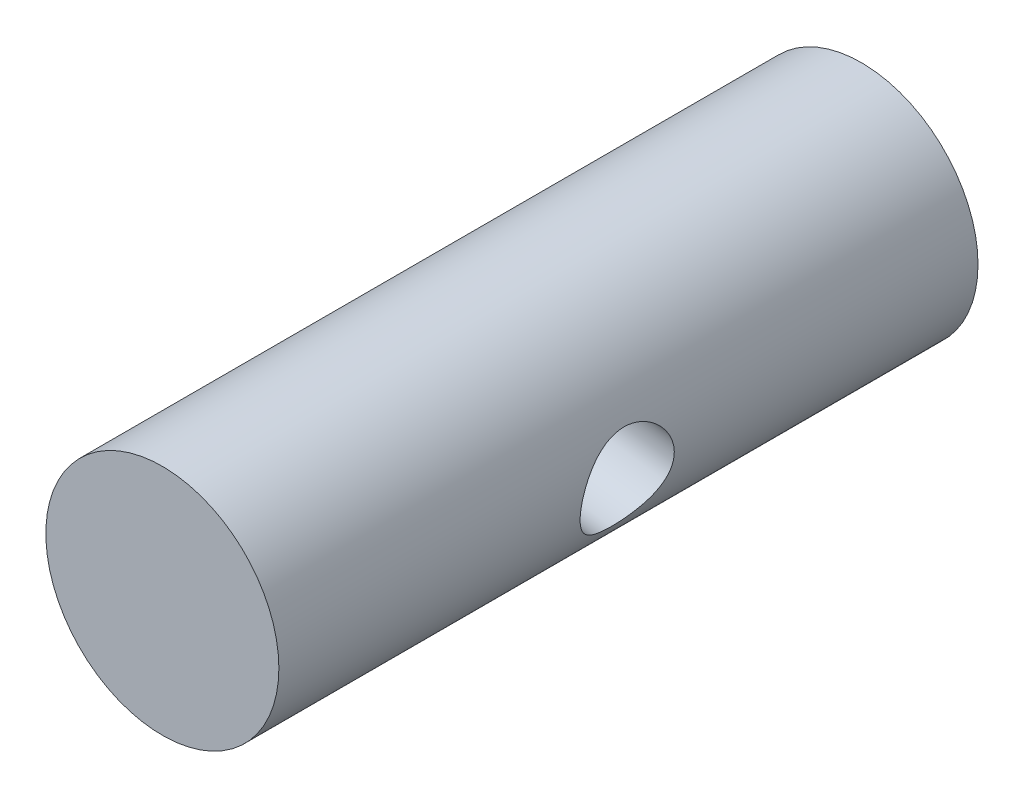
ISO-10303-21;
HEADER;
FILE_DESCRIPTION(('STEP AP214'),'2;1');
FILE_NAME('part.step','',(''),(''),'','','');
FILE_SCHEMA(('AUTOMOTIVE_DESIGN { 1 0 10303 214 1 1 1 1 }'));
ENDSEC;
DATA;
#1=APPLICATION_CONTEXT('core data for automotive mechanical design processes');
#2=APPLICATION_PROTOCOL_DEFINITION('international standard','automotive_design',2000,#1);
#3=PRODUCT_CONTEXT('',#1,'mechanical');
#4=PRODUCT('Part','Part','',(#3));
#5=PRODUCT_RELATED_PRODUCT_CATEGORY('part','',(#4));
#6=PRODUCT_DEFINITION_FORMATION('','',#4);
#7=PRODUCT_DEFINITION_CONTEXT('part definition',#1,'design');
#8=PRODUCT_DEFINITION('design','',#6,#7);
#9=PRODUCT_DEFINITION_SHAPE('','',#8);
#10=(LENGTH_UNIT() NAMED_UNIT(*) SI_UNIT(.MILLI.,.METRE.));
#11=(NAMED_UNIT(*) PLANE_ANGLE_UNIT() SI_UNIT($,.RADIAN.));
#12=(NAMED_UNIT(*) SI_UNIT($,.STERADIAN.) SOLID_ANGLE_UNIT());
#13=UNCERTAINTY_MEASURE_WITH_UNIT(LENGTH_MEASURE(1.E-05),#10,'distance_accuracy_value','');
#14=(GEOMETRIC_REPRESENTATION_CONTEXT(3) GLOBAL_UNCERTAINTY_ASSIGNED_CONTEXT((#13)) GLOBAL_UNIT_ASSIGNED_CONTEXT((#10,
#11,#12)) REPRESENTATION_CONTEXT('',''));
#15=CARTESIAN_POINT('',(0.,0.,0.));
#16=DIRECTION('',(0.,0.,1.));
#17=DIRECTION('',(1.,0.,0.));
#18=AXIS2_PLACEMENT_3D('',#15,#16,#17);
#19=CARTESIAN_POINT('',(-33.5766174717941,12.4461044017162,45.));
#20=DIRECTION('',(0.,0.,-1.));
#21=DIRECTION('',(-1.,0.,0.));
#22=AXIS2_PLACEMENT_3D('',#19,#20,#21);
#23=CYLINDRICAL_SURFACE('',#22,7.5);
#24=CARTESIAN_POINT('',(-41.0766174717941,12.4461044017162,25.3271667246397));
#25=CARTESIAN_POINT('',(-41.0766195167534,12.2840316834739,25.2701559364235));
#26=CARTESIAN_POINT('',(-41.0713251219842,12.1267471166384,25.1996267713023));
#27=CARTESIAN_POINT('',(-41.0524743925102,11.8262085538956,25.0340850774894));
#28=CARTESIAN_POINT('',(-41.0389160906901,11.6829579080069,24.9390667225741));
#29=CARTESIAN_POINT('',(-41.0065584154967,11.4144804951493,24.7275264892548));
#30=CARTESIAN_POINT('',(-40.9877688143819,11.2892207755205,24.6110448409583));
#31=CARTESIAN_POINT('',(-40.9482732230776,11.0596409339052,24.3592493013636));
#32=CARTESIAN_POINT('',(-40.9275669765714,10.9553236185152,24.2239328900337));
#33=CARTESIAN_POINT('',(-40.8872361850329,10.7685380046177,23.9340434791179));
#34=CARTESIAN_POINT('',(-40.8676496564719,10.6866558356965,23.7790854725441));
#35=CARTESIAN_POINT('',(-40.8336944102271,10.5514428320933,23.4566471416956));
#36=CARTESIAN_POINT('',(-40.8193226814829,10.4980955127323,23.2891741112688));
#37=CARTESIAN_POINT('',(-40.7991685619828,10.4246847189135,22.9564040941523));
#38=CARTESIAN_POINT('',(-40.7929511501042,10.402928214844,22.7915082811867));
#39=CARTESIAN_POINT('',(-40.7888067933822,10.3883387420311,22.4603650525413));
#40=CARTESIAN_POINT('',(-40.7908767554181,10.3954949821091,22.2941181642433));
#41=CARTESIAN_POINT('',(-40.8025279585241,10.4369719449292,21.9759248863782));
#42=CARTESIAN_POINT('',(-40.8116341739046,10.4695760157528,21.8237320371929));
#43=CARTESIAN_POINT('',(-40.8353176211019,10.5584159378546,21.5268724584596));
#44=CARTESIAN_POINT('',(-40.8498959776935,10.6146566478248,21.3822072831573));
#45=CARTESIAN_POINT('',(-40.8828893768335,10.7509796602895,21.099021006385));
#46=CARTESIAN_POINT('',(-40.9014167609814,10.8317987556948,20.9608690416803));
#47=CARTESIAN_POINT('',(-40.9392066978686,11.0139992757724,20.6989600445122));
#48=CARTESIAN_POINT('',(-40.9584695410594,11.1153888939099,20.5752087790093));
#49=CARTESIAN_POINT('',(-40.9962557047085,11.3445467090862,20.3358227743231));
#50=CARTESIAN_POINT('',(-41.0146124325414,11.4737314311459,20.2215132657612));
#51=CARTESIAN_POINT('',(-41.0454902561735,11.7495573546228,20.0152979154165));
#52=CARTESIAN_POINT('',(-41.0580107612794,11.8962003211317,19.9233943418226));
#53=CARTESIAN_POINT('',(-41.0743081726252,12.2041476821863,19.7642461538873));
#54=CARTESIAN_POINT('',(-41.0780228604502,12.3655480859651,19.6971798184526));
#55=CARTESIAN_POINT('',(-41.0742423697645,12.6972202008775,19.5912615207394));
#56=CARTESIAN_POINT('',(-41.0667532162678,12.8674870964208,19.5523944106418));
#57=CARTESIAN_POINT('',(-41.040351979514,13.2002564700796,19.5061193406549));
#58=CARTESIAN_POINT('',(-41.0221970374282,13.3625636498492,19.4968670459137));
#59=CARTESIAN_POINT('',(-40.9753841032461,13.6849609048589,19.504999396946));
#60=CARTESIAN_POINT('',(-40.9467281060925,13.8450513952245,19.5223789853089));
#61=CARTESIAN_POINT('',(-40.8815346964439,14.15257010376,19.5819140633023));
#62=CARTESIAN_POINT('',(-40.845319663715,14.3002468552143,19.6231511442026));
#63=CARTESIAN_POINT('',(-40.7665281718703,14.5855209183921,19.7281690792153));
#64=CARTESIAN_POINT('',(-40.7239506807771,14.7231165895802,19.7919535927695));
#65=CARTESIAN_POINT('',(-40.6332845513382,14.9905449794634,19.9430594207799));
#66=CARTESIAN_POINT('',(-40.5850446052934,15.1198559532316,20.0312113405568));
#67=CARTESIAN_POINT('',(-40.4877862661805,15.3620620760316,20.2274329000413));
#68=CARTESIAN_POINT('',(-40.4387675464084,15.4749501223591,20.3355111120683));
#69=CARTESIAN_POINT('',(-40.3404064630659,15.6889282374079,20.5766642295651));
#70=CARTESIAN_POINT('',(-40.2912439750879,15.7888016925813,20.7108958749127));
#71=CARTESIAN_POINT('',(-40.2003602778192,15.9654697872403,20.9960841034628));
#72=CARTESIAN_POINT('',(-40.1586392905291,16.0422637382474,21.1470411854134));
#73=CARTESIAN_POINT('',(-40.0869723677423,16.1704417555444,21.4614865514665));
#74=CARTESIAN_POINT('',(-40.0569899585934,16.2219046597562,21.6249341030048));
#75=CARTESIAN_POINT('',(-40.0121352418487,16.2978711736693,21.9599336705484));
#76=CARTESIAN_POINT('',(-39.9972517727565,16.3223946987144,22.1314796017186));
#77=CARTESIAN_POINT('',(-39.9849594052085,16.3426753921052,22.4637668889789));
#78=CARTESIAN_POINT('',(-39.9863106359775,16.3404734857261,22.6243407776664));
#79=CARTESIAN_POINT('',(-40.0033481284805,16.3122909351456,22.9425988481531));
#80=CARTESIAN_POINT('',(-40.0190339447159,16.2863110299305,23.100283119602));
#81=CARTESIAN_POINT('',(-40.0624308177079,16.2125315213167,23.4041390825087));
#82=CARTESIAN_POINT('',(-40.0898111709708,16.1653302232959,23.5505053726911));
#83=CARTESIAN_POINT('',(-40.1539566765074,16.0506718792254,23.8328654874384));
#84=CARTESIAN_POINT('',(-40.1907245113504,15.9832090422599,23.968856332662));
#85=CARTESIAN_POINT('',(-40.2732509674506,15.8245052248731,24.2362200169417));
#86=CARTESIAN_POINT('',(-40.3194407743103,15.7319960928933,24.3667067682876));
#87=CARTESIAN_POINT('',(-40.4152772039257,15.5275762601642,24.6100730588094));
#88=CARTESIAN_POINT('',(-40.4649251967536,15.4156578433375,24.7229455614832));
#89=CARTESIAN_POINT('',(-40.5667994571969,15.1675592243562,24.9343761373991));
#90=CARTESIAN_POINT('',(-40.6190113296504,15.0303595349613,25.0317511200797));
#91=CARTESIAN_POINT('',(-40.7190064942278,14.7395469491745,25.2009416765811));
#92=CARTESIAN_POINT('',(-40.7667909828829,14.5859385116646,25.2727641711292));
#93=CARTESIAN_POINT('',(-40.852925056542,14.2712359574669,25.3863573110114));
#94=CARTESIAN_POINT('',(-40.8915221026376,14.1105238851184,25.4289941040593));
#95=CARTESIAN_POINT('',(-40.9585624344238,13.7821202286831,25.4859149643479));
#96=CARTESIAN_POINT('',(-40.9870089849684,13.6144309082045,25.5002081549144));
#97=CARTESIAN_POINT('',(-41.0323846686489,13.2771091303131,25.499786718711));
#98=CARTESIAN_POINT('',(-41.0492847935669,13.1074728596235,25.4849993910784));
#99=CARTESIAN_POINT('',(-41.0714018178324,12.772354591623,25.4269695395214));
#100=CARTESIAN_POINT('',(-41.0766154432798,12.6068737712704,25.3837190462069));
#101=CARTESIAN_POINT('',(-41.0766174717941,12.4461044017162,25.3271667246397));
#102=B_SPLINE_CURVE_WITH_KNOTS('',3,(#24,#25,#26,#27,#28,#29,#30,#31,#32,#33,#34,#35,#36,#37,
#38,#39,#40,#41,#42,#43,#44,#45,#46,#47,#48,#49,#50,#51,#52,#53,#54,#55,#56,#57,#58,#59,#60,#61,
#62,#63,#64,#65,#66,#67,#68,#69,#70,#71,#72,#73,#74,#75,#76,#77,#78,#79,#80,#81,#82,#83,#84,#85,
#86,#87,#88,#89,#90,#91,#92,#93,#94,#95,#96,#97,#98,#99,#100,#101),.UNSPECIFIED.,.T.,.F.,(4,2,2,
2,2,2,2,2,2,2,2,2,2,2,2,2,2,2,2,2,2,2,2,2,2,2,2,2,2,2,2,2,2,2,2,2,2,2,4),(0.,0.514757588974464,
1.02963775716722,1.54356249022761,2.05755605100425,2.58391734242355,3.10997422382251,
3.60664064313144,4.10312170746979,4.56873342254672,5.034440894521,5.51577777597042,
5.99730675691277,6.51531713686903,7.03337993409969,7.555092387492,8.07652438393042,
8.5647785792817,9.05294006635833,9.52345361816299,9.9940435692695,10.4832325466679,
10.9726324670163,11.493338197489,12.0140594594526,12.5331496664461,13.0518558693597,
13.5312164171057,14.0105620675126,14.4771670598917,14.943905538963,15.4412189998124,
15.9387306205977,16.4646085539783,16.990343948071,17.499708365938,18.0089088013932,
18.5193838486944,19.0300018845377),.UNSPECIFIED.);
#103=CARTESIAN_POINT('',(-41.0766174717941,12.4461044017162,25.3271667246397));
#104=VERTEX_POINT('',#103);
#105=EDGE_CURVE('E45',#104,#104,#102,.T.);
#106=ORIENTED_EDGE('',*,*,#105,.T.);
#107=EDGE_LOOP('',(#106));
#108=FACE_BOUND('',#107,.T.);
#109=CARTESIAN_POINT('',(-27.1659915553898,8.55330651845455,22.5));
#110=CARTESIAN_POINT('',(-27.1659838941345,8.55331244560013,22.6606855345694));
#111=CARTESIAN_POINT('',(-27.1585921519483,8.56541268487361,22.8216394414978));
#112=CARTESIAN_POINT('',(-27.1298217414302,8.61340651574341,23.1389086261494));
#113=CARTESIAN_POINT('',(-27.1084073337877,8.64936090707508,23.2952109815078));
#114=CARTESIAN_POINT('',(-27.0539686986069,8.74367560878095,23.5980777134562));
#115=CARTESIAN_POINT('',(-27.0209882478523,8.80195150921461,23.7446763649368));
#116=CARTESIAN_POINT('',(-26.9465150813127,8.93927961087184,24.0253280322934));
#117=CARTESIAN_POINT('',(-26.9050242245689,9.01832727570078,24.1593837787862));
#118=CARTESIAN_POINT('',(-26.8146331285855,9.20012567200846,24.4188904718165));
#119=CARTESIAN_POINT('',(-26.7654602216722,9.30389307438259,24.5435345990959));
#120=CARTESIAN_POINT('',(-26.6654040989771,9.53054844410047,24.7732935312837));
#121=CARTESIAN_POINT('',(-26.614520292824,9.65344306577684,24.8784015115646));
#122=CARTESIAN_POINT('',(-26.5128950175686,9.92120881173314,25.0701095854646));
#123=CARTESIAN_POINT('',(-26.4622382788261,10.0667554249162,25.1558164495289));
#124=CARTESIAN_POINT('',(-26.3671850485596,10.3725418778627,25.3002653552607));
#125=CARTESIAN_POINT('',(-26.3227860147408,10.5327757067867,25.3590183693733));
#126=CARTESIAN_POINT('',(-26.2454663280151,10.8553853770262,25.4450122289896));
#127=CARTESIAN_POINT('',(-26.2120940343519,11.0172819551673,25.4736409709553));
#128=CARTESIAN_POINT('',(-26.1559684954873,11.3453662689067,25.5030427286722));
#129=CARTESIAN_POINT('',(-26.1332112927594,11.5115523808522,25.5038261339487));
#130=CARTESIAN_POINT('',(-26.100022107302,11.8335182430915,25.4782758452937));
#131=CARTESIAN_POINT('',(-26.08896961977,11.9893581919994,25.4534628408679));
#132=CARTESIAN_POINT('',(-26.0765582622192,12.2956957385132,25.3800106855455));
#133=CARTESIAN_POINT('',(-26.0752001035847,12.4461929432543,25.3313697864023));
#134=CARTESIAN_POINT('',(-26.080918036425,12.7401128573876,25.2110452756826));
#135=CARTESIAN_POINT('',(-26.0881215519785,12.8833947597481,25.1390254277769));
#136=CARTESIAN_POINT('',(-26.1091223998381,13.1570010818583,24.9743024896213));
#137=CARTESIAN_POINT('',(-26.1229219939793,13.2873210383462,24.8815923103497));
#138=CARTESIAN_POINT('',(-26.1556714970476,13.5401159575641,24.6710262960842));
#139=CARTESIAN_POINT('',(-26.1749000647442,13.661514109536,24.5519191611408));
#140=CARTESIAN_POINT('',(-26.2147070925594,13.8831076732731,24.295514142252));
#141=CARTESIAN_POINT('',(-26.2352859916647,13.9832961446818,24.1582103277066));
#142=CARTESIAN_POINT('',(-26.274919931961,14.1618665665843,23.8643714664391));
#143=CARTESIAN_POINT('',(-26.2939155102974,14.2395526220932,23.707402754492));
#144=CARTESIAN_POINT('',(-26.3262097416915,14.3659731113392,23.3816767645317));
#145=CARTESIAN_POINT('',(-26.3395120932744,14.4147263488614,23.2129272229101));
#146=CARTESIAN_POINT('',(-26.357257916635,14.4788103397646,22.8794463337988));
#147=CARTESIAN_POINT('',(-26.3621929519851,14.4960009976702,22.7150993293072));
#148=CARTESIAN_POINT('',(-26.3638438101281,14.5018079598473,22.3858841883607));
#149=CARTESIAN_POINT('',(-26.3605621253929,14.4904329292734,22.2210162250865));
#150=CARTESIAN_POINT('',(-26.3468035155381,14.4411900719449,21.9053115975646));
#151=CARTESIAN_POINT('',(-26.3367470449162,14.4048680570192,21.7542105938999));
#152=CARTESIAN_POINT('',(-26.3114730966869,14.3089301558024,21.4600673928218));
#153=CARTESIAN_POINT('',(-26.2962544748285,14.2493091045622,21.3170269903393));
#154=CARTESIAN_POINT('',(-26.262226159429,14.1060129440098,21.0365964633065));
#155=CARTESIAN_POINT('',(-26.243295864061,14.0214604133617,20.8996707169582));
#156=CARTESIAN_POINT('',(-26.20513496682,13.8319535496561,20.6407755188376));
#157=CARTESIAN_POINT('',(-26.1859042455964,13.7269909083845,20.5188121908068));
#158=CARTESIAN_POINT('',(-26.1487112588047,13.4908547086214,20.2839398871009));
#159=CARTESIAN_POINT('',(-26.1309476119194,13.3583177592042,20.1723651520626));
#160=CARTESIAN_POINT('',(-26.1017892504817,13.0762065137051,19.9722343850853));
#161=CARTESIAN_POINT('',(-26.0903947951506,12.9266315244859,19.8836792901073));
#162=CARTESIAN_POINT('',(-26.0768841319734,12.6145166357428,19.732428560305));
#163=CARTESIAN_POINT('',(-26.0747657013907,12.451979851652,19.6697267337395));
#164=CARTESIAN_POINT('',(-26.081911315665,12.118902898404,19.5726767214004));
#165=CARTESIAN_POINT('',(-26.0911691763574,11.9483671259596,19.538313147884));
#166=CARTESIAN_POINT('',(-26.1209282362823,11.616237732456,19.5007429475207));
#167=CARTESIAN_POINT('',(-26.1406564721372,11.4547866167923,19.495649807157));
#168=CARTESIAN_POINT('',(-26.1903640001327,11.1348240517945,19.5117832190752));
#169=CARTESIAN_POINT('',(-26.2203417400296,10.9763121611573,19.5330057872334));
#170=CARTESIAN_POINT('',(-26.2879410966908,10.6716094775924,19.5998201819998));
#171=CARTESIAN_POINT('',(-26.3252996252831,10.525189777194,19.6446434171348));
#172=CARTESIAN_POINT('',(-26.4060124949298,10.2429261457831,19.7565792088216));
#173=CARTESIAN_POINT('',(-26.4493679409887,10.1070841710707,19.8236958764086));
#174=CARTESIAN_POINT('',(-26.5413927353913,9.84302384510932,19.9816547900299));
#175=CARTESIAN_POINT('',(-26.5902122429728,9.71540765474868,20.0734144129877));
#176=CARTESIAN_POINT('',(-26.6881074963939,9.47708816470054,20.2766828081205));
#177=CARTESIAN_POINT('',(-26.7371833400989,9.36639190067102,20.3881997544123));
#178=CARTESIAN_POINT('',(-26.8349467313997,9.1576429478262,20.635972720273));
#179=CARTESIAN_POINT('',(-26.8834221663175,9.0607971947145,20.7733328627161));
#180=CARTESIAN_POINT('',(-26.9722297439762,8.89064180293905,21.0644136535812));
#181=CARTESIAN_POINT('',(-27.0125609291041,8.81733493141476,21.2181362226803));
#182=CARTESIAN_POINT('',(-27.0778012361366,8.70185610678068,21.5235542797053));
#183=CARTESIAN_POINT('',(-27.1037699536504,8.6574795487579,21.6741924040687));
#184=CARTESIAN_POINT('',(-27.1428525618694,8.59147370430019,21.981733562239));
#185=CARTESIAN_POINT('',(-27.156002266023,8.56978103176656,22.1386178601365));
#186=CARTESIAN_POINT('',(-27.1633789544084,8.55761262296195,22.3301673586673));
#187=CARTESIAN_POINT('',(-27.1643571486311,8.55599907425869,22.3641022205347));
#188=CARTESIAN_POINT('',(-27.1656642833551,8.55384535566296,22.4320207151958));
#189=CARTESIAN_POINT('',(-27.1659931762535,8.55330526447012,22.4660043513827));
#190=CARTESIAN_POINT('',(-27.1659915553898,8.55330651845455,22.5));
#191=B_SPLINE_CURVE_WITH_KNOTS('',3,(#109,#110,#111,#112,#113,#114,#115,#116,#117,#118,#119,
#120,#121,#122,#123,#124,#125,#126,#127,#128,#129,#130,#131,#132,#133,#134,#135,#136,#137,#138,
#139,#140,#141,#142,#143,#144,#145,#146,#147,#148,#149,#150,#151,#152,#153,#154,#155,#156,#157,
#158,#159,#160,#161,#162,#163,#164,#165,#166,#167,#168,#169,#170,#171,#172,#173,#174,#175,#176,
#177,#178,#179,#180,#181,#182,#183,#184,#185,#186,#187,#188,#189,#190),.UNSPECIFIED.,.T.,.F.,(4,
2,2,2,2,2,2,2,2,2,2,2,2,2,2,2,2,2,2,2,2,2,2,2,2,2,2,2,2,2,2,2,2,2,2,2,2,2,2,2,4),(0.,
0.481916473151482,0.96506600373337,1.44640623494008,1.92764143235792,2.43383427426637,
2.94020361522514,3.46654003637143,3.9926620045422,4.49331274330775,4.99377667958508,
5.46612967245454,5.9385173269359,6.41802450352347,6.89769622410047,7.40886066122034,
7.92019210690691,8.44596688075886,8.97139957200152,9.4647322128663,9.95791522361909,
10.4230087212772,10.8882053797746,11.3722673197905,11.8565267178877,12.3765560137047,
12.8966064727912,13.4165323096922,13.936175639312,14.4219155963393,14.907582022689,
15.3783299166503,15.8491646674288,16.3408057670989,16.8326507484631,17.3549437992842,
17.8772982263878,18.3527499122861,18.8268694532887,18.928819278144,19.0307765770883),.UNSPECIFIED.);
#192=CARTESIAN_POINT('',(-27.1659915553898,8.55330651845455,22.5));
#193=VERTEX_POINT('',#192);
#194=EDGE_CURVE('E61',#193,#193,#191,.T.);
#195=ORIENTED_EDGE('',*,*,#194,.T.);
#196=EDGE_LOOP('',(#195));
#197=FACE_BOUND('',#196,.T.);
#198=CARTESIAN_POINT('',(-33.5766174717941,12.4461044017162,45.));
#199=DIRECTION('',(0.,0.,1.));
#200=DIRECTION('',(1.,0.,0.));
#201=AXIS2_PLACEMENT_3D('',#198,#199,#200);
#202=CIRCLE('',#201,7.5);
#203=CARTESIAN_POINT('',(-26.0766174717941,12.4461044017162,45.));
#204=VERTEX_POINT('',#203);
#205=EDGE_CURVE('E10',#204,#204,#202,.T.);
#206=ORIENTED_EDGE('',*,*,#205,.F.);
#207=EDGE_LOOP('',(#206));
#208=FACE_BOUND('',#207,.T.);
#209=CARTESIAN_POINT('',(-33.5766174717941,12.4461044017162,0.));
#210=DIRECTION('',(0.,0.,1.));
#211=DIRECTION('',(1.,0.,0.));
#212=AXIS2_PLACEMENT_3D('',#209,#210,#211);
#213=CIRCLE('',#212,7.5);
#214=CARTESIAN_POINT('',(-26.0766174717941,12.4461044017162,0.));
#215=VERTEX_POINT('',#214);
#216=EDGE_CURVE('E54',#215,#215,#213,.T.);
#217=ORIENTED_EDGE('',*,*,#216,.T.);
#218=EDGE_LOOP('',(#217));
#219=FACE_BOUND('',#218,.T.);
#220=ADVANCED_FACE('F41',(#108,#197,#208,#219),#23,.T.);
#221=CARTESIAN_POINT('',(-33.5766174717941,12.4461044017162,45.));
#222=DIRECTION('',(0.,0.,1.));
#223=DIRECTION('',(1.,0.,0.));
#224=AXIS2_PLACEMENT_3D('',#221,#222,#223);
#225=PLANE('',#224);
#226=ORIENTED_EDGE('',*,*,#205,.T.);
#227=EDGE_LOOP('',(#226));
#228=FACE_BOUND('',#227,.T.);
#229=ADVANCED_FACE('F73',(#228),#225,.T.);
#230=CARTESIAN_POINT('',(-33.5766174717941,12.4461044017162,0.));
#231=DIRECTION('',(0.,0.,1.));
#232=DIRECTION('',(1.,0.,0.));
#233=AXIS2_PLACEMENT_3D('',#230,#231,#232);
#234=PLANE('',#233);
#235=ORIENTED_EDGE('',*,*,#216,.F.);
#236=EDGE_LOOP('',(#235));
#237=FACE_BOUND('',#236,.T.);
#238=ADVANCED_FACE('F71',(#237),#234,.F.);
#239=CARTESIAN_POINT('',(-25.2163681003951,11.3172874806932,22.5));
#240=DIRECTION('',(-0.991007314146436,0.133807710197383,0.));
#241=DIRECTION('',(-0.133807710197383,-0.991007314146436,0.));
#242=AXIS2_PLACEMENT_3D('',#239,#240,#241);
#243=CYLINDRICAL_SURFACE('',#242,3.);
#244=ORIENTED_EDGE('',*,*,#194,.F.);
#245=EDGE_LOOP('',(#244));
#246=FACE_BOUND('',#245,.T.);
#247=ORIENTED_EDGE('',*,*,#105,.F.);
#248=EDGE_LOOP('',(#247));
#249=FACE_BOUND('',#248,.T.);
#250=ADVANCED_FACE('F67',(#246,#249),#243,.F.);
#251=CLOSED_SHELL('',(#220,#229,#238,#250));
#252=MANIFOLD_SOLID_BREP('B2',#251);
#253=ADVANCED_BREP_SHAPE_REPRESENTATION('',(#18,#252),#14);
#254=SHAPE_DEFINITION_REPRESENTATION(#9,#253);
ENDSEC;
END-ISO-10303-21;
